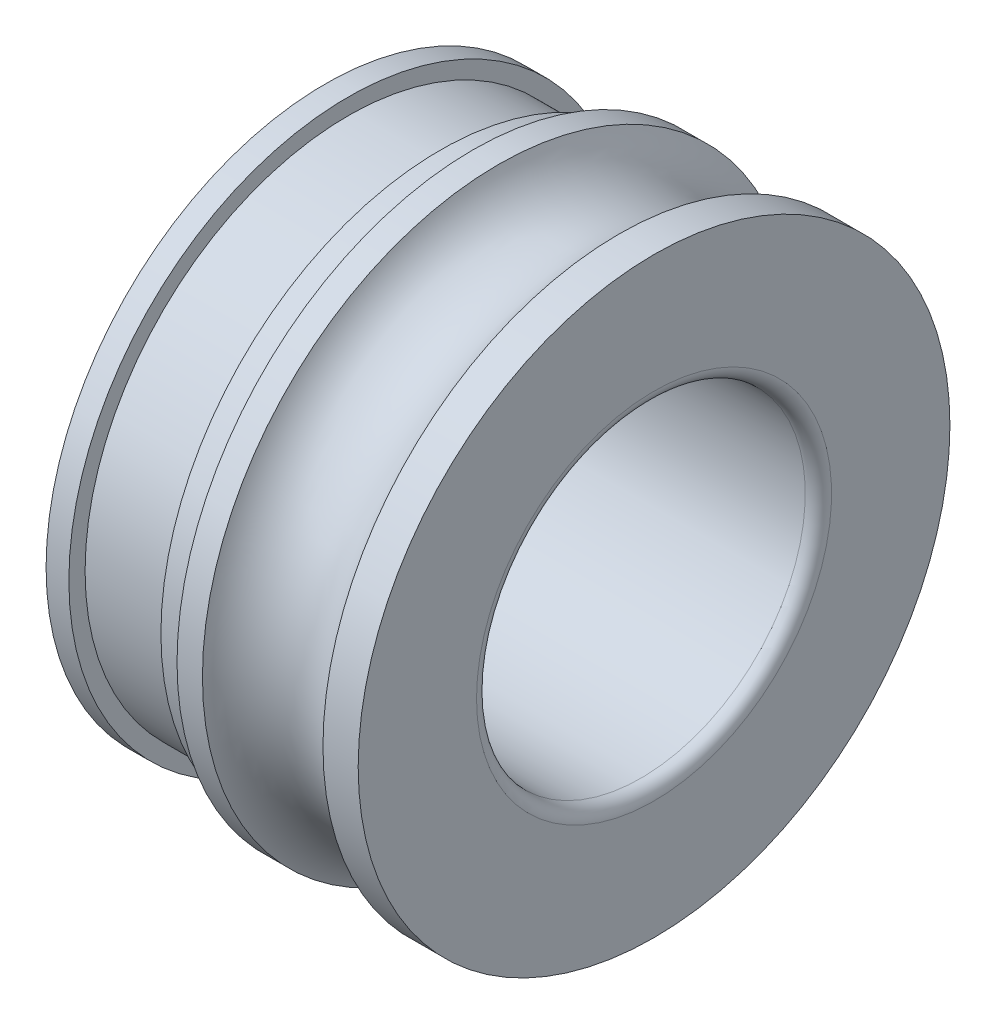
ISO-10303-21;
HEADER;
FILE_DESCRIPTION(('STEP AP214'),'2;1');
FILE_NAME('part.step','',(''),(''),'','','');
FILE_SCHEMA(('AUTOMOTIVE_DESIGN { 1 0 10303 214 1 1 1 1 }'));
ENDSEC;
DATA;
#1=APPLICATION_CONTEXT('core data for automotive mechanical design processes');
#2=APPLICATION_PROTOCOL_DEFINITION('international standard','automotive_design',2000,#1);
#3=PRODUCT_CONTEXT('',#1,'mechanical');
#4=PRODUCT('Part','Part','',(#3));
#5=PRODUCT_RELATED_PRODUCT_CATEGORY('part','',(#4));
#6=PRODUCT_DEFINITION_FORMATION('','',#4);
#7=PRODUCT_DEFINITION_CONTEXT('part definition',#1,'design');
#8=PRODUCT_DEFINITION('design','',#6,#7);
#9=PRODUCT_DEFINITION_SHAPE('','',#8);
#10=(LENGTH_UNIT() NAMED_UNIT(*) SI_UNIT(.MILLI.,.METRE.));
#11=(NAMED_UNIT(*) PLANE_ANGLE_UNIT() SI_UNIT($,.RADIAN.));
#12=(NAMED_UNIT(*) SI_UNIT($,.STERADIAN.) SOLID_ANGLE_UNIT());
#13=UNCERTAINTY_MEASURE_WITH_UNIT(LENGTH_MEASURE(1.E-05),#10,'distance_accuracy_value','');
#14=(GEOMETRIC_REPRESENTATION_CONTEXT(3) GLOBAL_UNCERTAINTY_ASSIGNED_CONTEXT((#13)) GLOBAL_UNIT_ASSIGNED_CONTEXT((#10,
#11,#12)) REPRESENTATION_CONTEXT('',''));
#15=CARTESIAN_POINT('',(0.,0.,0.));
#16=DIRECTION('',(0.,0.,1.));
#17=DIRECTION('',(1.,0.,0.));
#18=AXIS2_PLACEMENT_3D('',#15,#16,#17);
#19=CARTESIAN_POINT('',(11.2321867507415,0.,0.));
#20=DIRECTION('',(1.,0.,0.));
#21=DIRECTION('',(0.,0.,-1.));
#22=AXIS2_PLACEMENT_3D('',#19,#20,#21);
#23=CONICAL_SURFACE('',#22,21.25,0.00652812454173153);
#24=CARTESIAN_POINT('',(8.73218675074151,0.,0.));
#25=DIRECTION('',(-1.,0.,0.));
#26=DIRECTION('',(0.,0.,1.));
#27=AXIS2_PLACEMENT_3D('',#24,#25,#26);
#28=CIRCLE('',#27,21.233679456804);
#29=CARTESIAN_POINT('',(8.73218675074151,0.,21.233679456804));
#30=VERTEX_POINT('',#29);
#31=EDGE_CURVE('E77',#30,#30,#28,.T.);
#32=ORIENTED_EDGE('',*,*,#31,.F.);
#33=EDGE_LOOP('',(#32));
#34=FACE_BOUND('',#33,.T.);
#35=CARTESIAN_POINT('',(11.2321867507415,0.,0.));
#36=DIRECTION('',(-1.,0.,0.));
#37=DIRECTION('',(0.,0.,1.));
#38=AXIS2_PLACEMENT_3D('',#35,#36,#37);
#39=CIRCLE('',#38,21.25);
#40=CARTESIAN_POINT('',(11.2321867507415,0.,21.25));
#41=VERTEX_POINT('',#40);
#42=EDGE_CURVE('E10',#41,#41,#39,.T.);
#43=ORIENTED_EDGE('',*,*,#42,.T.);
#44=EDGE_LOOP('',(#43));
#45=FACE_BOUND('',#44,.T.);
#46=ADVANCED_FACE('F31',(#34,#45),#23,.T.);
#47=CARTESIAN_POINT('',(11.2240265104039,0.,0.));
#48=DIRECTION('',(-1.,0.,0.));
#49=DIRECTION('',(0.,0.,1.));
#50=AXIS2_PLACEMENT_3D('',#47,#48,#49);
#51=CONICAL_SURFACE('',#50,22.4999952114941,1.56426820225317);
#52=ORIENTED_EDGE('',*,*,#42,.F.);
#53=EDGE_LOOP('',(#52));
#54=FACE_BOUND('',#53,.T.);
#55=CARTESIAN_POINT('',(11.2240265104039,0.,0.));
#56=DIRECTION('',(-1.,0.,0.));
#57=DIRECTION('',(0.,0.,1.));
#58=AXIS2_PLACEMENT_3D('',#55,#56,#57);
#59=CIRCLE('',#58,22.4999952114941);
#60=CARTESIAN_POINT('',(11.2240265104039,0.,22.4999952114941));
#61=VERTEX_POINT('',#60);
#62=EDGE_CURVE('E37',#61,#61,#59,.T.);
#63=ORIENTED_EDGE('',*,*,#62,.T.);
#64=EDGE_LOOP('',(#63));
#65=FACE_BOUND('',#64,.T.);
#66=ADVANCED_FACE('F84',(#54,#65),#51,.F.);
#67=CARTESIAN_POINT('',(0.,0.,0.));
#68=DIRECTION('',(-1.,0.,0.));
#69=DIRECTION('',(0.,0.,1.));
#70=AXIS2_PLACEMENT_3D('',#67,#68,#69);
#71=CYLINDRICAL_SURFACE('',#70,22.4999952114941);
#72=ORIENTED_EDGE('',*,*,#62,.F.);
#73=EDGE_LOOP('',(#72));
#74=FACE_BOUND('',#73,.T.);
#75=CARTESIAN_POINT('',(13.1562316517497,0.,0.));
#76=DIRECTION('',(-1.,0.,0.));
#77=DIRECTION('',(0.,0.,1.));
#78=AXIS2_PLACEMENT_3D('',#75,#76,#77);
#79=CIRCLE('',#78,22.4999952114941);
#80=CARTESIAN_POINT('',(13.1562316517497,0.,22.4999952114941));
#81=VERTEX_POINT('',#80);
#82=EDGE_CURVE('E41',#81,#81,#79,.T.);
#83=ORIENTED_EDGE('',*,*,#82,.T.);
#84=EDGE_LOOP('',(#83));
#85=FACE_BOUND('',#84,.T.);
#86=ADVANCED_FACE('F88',(#74,#85),#71,.T.);
#87=CARTESIAN_POINT('',(17.7388073467056,0.,0.));
#88=DIRECTION('',(-1.,0.,0.));
#89=DIRECTION('',(0.,0.,1.));
#90=AXIS2_PLACEMENT_3D('',#87,#88,#89);
#91=TOROIDAL_SURFACE('',#90,24.4999952114941,5.);
#92=ORIENTED_EDGE('',*,*,#82,.F.);
#93=EDGE_LOOP('',(#92));
#94=FACE_BOUND('',#93,.T.);
#95=CARTESIAN_POINT('',(22.3213830416614,0.,0.));
#96=DIRECTION('',(-1.,0.,0.));
#97=DIRECTION('',(0.,0.,1.));
#98=AXIS2_PLACEMENT_3D('',#95,#96,#97);
#99=CIRCLE('',#98,22.4999952114941);
#100=CARTESIAN_POINT('',(22.3213830416614,0.,22.4999952114941));
#101=VERTEX_POINT('',#100);
#102=EDGE_CURVE('E45',#101,#101,#99,.T.);
#103=ORIENTED_EDGE('',*,*,#102,.T.);
#104=EDGE_LOOP('',(#103));
#105=FACE_BOUND('',#104,.T.);
#106=ADVANCED_FACE('F93',(#94,#105),#91,.F.);
#107=CARTESIAN_POINT('',(0.,0.,0.));
#108=DIRECTION('',(-1.,0.,0.));
#109=DIRECTION('',(0.,0.,1.));
#110=AXIS2_PLACEMENT_3D('',#107,#108,#109);
#111=CYLINDRICAL_SURFACE('',#110,22.499997605747);
#112=ORIENTED_EDGE('',*,*,#102,.F.);
#113=EDGE_LOOP('',(#112));
#114=FACE_BOUND('',#113,.T.);
#115=CARTESIAN_POINT('',(25.,0.,0.));
#116=DIRECTION('',(-1.,0.,0.));
#117=DIRECTION('',(0.,0.,1.));
#118=AXIS2_PLACEMENT_3D('',#115,#116,#117);
#119=CIRCLE('',#118,22.5);
#120=CARTESIAN_POINT('',(25.,0.,22.5));
#121=VERTEX_POINT('',#120);
#122=EDGE_CURVE('E50',#121,#121,#119,.T.);
#123=ORIENTED_EDGE('',*,*,#122,.T.);
#124=EDGE_LOOP('',(#123));
#125=FACE_BOUND('',#124,.T.);
#126=ADVANCED_FACE('F99',(#114,#125),#111,.T.);
#127=CARTESIAN_POINT('',(25.,13.5,0.));
#128=DIRECTION('',(-1.,0.,0.));
#129=DIRECTION('',(0.,0.,1.));
#130=AXIS2_PLACEMENT_3D('',#127,#128,#129);
#131=PLANE('',#130);
#132=ORIENTED_EDGE('',*,*,#122,.F.);
#133=EDGE_LOOP('',(#132));
#134=FACE_BOUND('',#133,.T.);
#135=CARTESIAN_POINT('',(25.,0.,0.));
#136=DIRECTION('',(-1.,0.,0.));
#137=DIRECTION('',(0.,0.,1.));
#138=AXIS2_PLACEMENT_3D('',#135,#136,#137);
#139=CIRCLE('',#138,13.5);
#140=CARTESIAN_POINT('',(25.,0.,13.5));
#141=VERTEX_POINT('',#140);
#142=EDGE_CURVE('E53',#141,#141,#139,.T.);
#143=ORIENTED_EDGE('',*,*,#142,.T.);
#144=EDGE_LOOP('',(#143));
#145=FACE_BOUND('',#144,.T.);
#146=ADVANCED_FACE('F103',(#134,#145),#131,.F.);
#147=CARTESIAN_POINT('',(24.,0.,0.));
#148=DIRECTION('',(-1.,0.,0.));
#149=DIRECTION('',(0.,0.,1.));
#150=AXIS2_PLACEMENT_3D('',#147,#148,#149);
#151=TOROIDAL_SURFACE('',#150,13.5,1.);
#152=ORIENTED_EDGE('',*,*,#142,.F.);
#153=EDGE_LOOP('',(#152));
#154=FACE_BOUND('',#153,.T.);
#155=CARTESIAN_POINT('',(24.,0.,0.));
#156=DIRECTION('',(-1.,0.,0.));
#157=DIRECTION('',(0.,0.,1.));
#158=AXIS2_PLACEMENT_3D('',#155,#156,#157);
#159=CIRCLE('',#158,12.5);
#160=CARTESIAN_POINT('',(24.,0.,12.5));
#161=VERTEX_POINT('',#160);
#162=EDGE_CURVE('E56',#161,#161,#159,.T.);
#163=ORIENTED_EDGE('',*,*,#162,.T.);
#164=EDGE_LOOP('',(#163));
#165=FACE_BOUND('',#164,.T.);
#166=ADVANCED_FACE('F107',(#154,#165),#151,.T.);
#167=CARTESIAN_POINT('',(0.,0.,0.));
#168=DIRECTION('',(-1.,0.,0.));
#169=DIRECTION('',(0.,0.,1.));
#170=AXIS2_PLACEMENT_3D('',#167,#168,#169);
#171=CYLINDRICAL_SURFACE('',#170,12.5);
#172=ORIENTED_EDGE('',*,*,#162,.F.);
#173=EDGE_LOOP('',(#172));
#174=FACE_BOUND('',#173,.T.);
#175=CARTESIAN_POINT('',(1.00000000000001,0.,0.));
#176=DIRECTION('',(-1.,0.,0.));
#177=DIRECTION('',(0.,0.,1.));
#178=AXIS2_PLACEMENT_3D('',#175,#176,#177);
#179=CIRCLE('',#178,12.5);
#180=CARTESIAN_POINT('',(1.00000000000001,0.,12.5));
#181=VERTEX_POINT('',#180);
#182=EDGE_CURVE('E59',#181,#181,#179,.T.);
#183=ORIENTED_EDGE('',*,*,#182,.T.);
#184=EDGE_LOOP('',(#183));
#185=FACE_BOUND('',#184,.T.);
#186=ADVANCED_FACE('F111',(#174,#185),#171,.F.);
#187=CARTESIAN_POINT('',(1.,0.,0.));
#188=DIRECTION('',(-1.,0.,0.));
#189=DIRECTION('',(0.,0.,1.));
#190=AXIS2_PLACEMENT_3D('',#187,#188,#189);
#191=TOROIDAL_SURFACE('',#190,13.5,1.);
#192=ORIENTED_EDGE('',*,*,#182,.F.);
#193=EDGE_LOOP('',(#192));
#194=FACE_BOUND('',#193,.T.);
#195=CARTESIAN_POINT('',(0.,0.,0.));
#196=DIRECTION('',(-1.,0.,0.));
#197=DIRECTION('',(0.,0.,1.));
#198=AXIS2_PLACEMENT_3D('',#195,#196,#197);
#199=CIRCLE('',#198,13.5);
#200=CARTESIAN_POINT('',(0.,0.,13.5));
#201=VERTEX_POINT('',#200);
#202=EDGE_CURVE('E62',#201,#201,#199,.T.);
#203=ORIENTED_EDGE('',*,*,#202,.T.);
#204=EDGE_LOOP('',(#203));
#205=FACE_BOUND('',#204,.T.);
#206=ADVANCED_FACE('F115',(#194,#205),#191,.T.);
#207=CARTESIAN_POINT('',(0.,21.233679456804,0.));
#208=DIRECTION('',(1.,0.,0.));
#209=DIRECTION('',(0.,0.,-1.));
#210=AXIS2_PLACEMENT_3D('',#207,#208,#209);
#211=PLANE('',#210);
#212=ORIENTED_EDGE('',*,*,#202,.F.);
#213=EDGE_LOOP('',(#212));
#214=FACE_BOUND('',#213,.T.);
#215=CARTESIAN_POINT('',(0.,0.,0.));
#216=DIRECTION('',(-1.,0.,0.));
#217=DIRECTION('',(0.,0.,1.));
#218=AXIS2_PLACEMENT_3D('',#215,#216,#217);
#219=CIRCLE('',#218,21.233679456804);
#220=CARTESIAN_POINT('',(0.,0.,21.233679456804));
#221=VERTEX_POINT('',#220);
#222=EDGE_CURVE('E65',#221,#221,#219,.T.);
#223=ORIENTED_EDGE('',*,*,#222,.T.);
#224=EDGE_LOOP('',(#223));
#225=FACE_BOUND('',#224,.T.);
#226=ADVANCED_FACE('F119',(#214,#225),#211,.F.);
#227=CARTESIAN_POINT('',(0.,0.,0.));
#228=DIRECTION('',(-1.,0.,0.));
#229=DIRECTION('',(0.,0.,1.));
#230=AXIS2_PLACEMENT_3D('',#227,#228,#229);
#231=CYLINDRICAL_SURFACE('',#230,21.233679456804);
#232=ORIENTED_EDGE('',*,*,#222,.F.);
#233=EDGE_LOOP('',(#232));
#234=FACE_BOUND('',#233,.T.);
#235=CARTESIAN_POINT('',(1.73218675074151,0.,0.));
#236=DIRECTION('',(-1.,0.,0.));
#237=DIRECTION('',(0.,0.,1.));
#238=AXIS2_PLACEMENT_3D('',#235,#236,#237);
#239=CIRCLE('',#238,21.233679456804);
#240=CARTESIAN_POINT('',(1.73218675074151,0.,21.233679456804));
#241=VERTEX_POINT('',#240);
#242=EDGE_CURVE('E68',#241,#241,#239,.T.);
#243=ORIENTED_EDGE('',*,*,#242,.T.);
#244=EDGE_LOOP('',(#243));
#245=FACE_BOUND('',#244,.T.);
#246=ADVANCED_FACE('F123',(#234,#245),#231,.T.);
#247=CARTESIAN_POINT('',(1.73218675074151,21.233679456804,0.));
#248=DIRECTION('',(-1.,0.,0.));
#249=DIRECTION('',(0.,0.,1.));
#250=AXIS2_PLACEMENT_3D('',#247,#248,#249);
#251=PLANE('',#250);
#252=ORIENTED_EDGE('',*,*,#242,.F.);
#253=EDGE_LOOP('',(#252));
#254=FACE_BOUND('',#253,.T.);
#255=CARTESIAN_POINT('',(1.73218675074156,0.,0.));
#256=DIRECTION('',(-1.,0.,0.));
#257=DIRECTION('',(0.,0.,1.));
#258=AXIS2_PLACEMENT_3D('',#255,#256,#257);
#259=CIRCLE('',#258,19.9999999999999);
#260=CARTESIAN_POINT('',(1.73218675074156,0.,19.9999999999999));
#261=VERTEX_POINT('',#260);
#262=EDGE_CURVE('E71',#261,#261,#259,.T.);
#263=ORIENTED_EDGE('',*,*,#262,.T.);
#264=EDGE_LOOP('',(#263));
#265=FACE_BOUND('',#264,.T.);
#266=ADVANCED_FACE('F127',(#254,#265),#251,.F.);
#267=CARTESIAN_POINT('',(0.,0.,0.));
#268=DIRECTION('',(-1.,0.,0.));
#269=DIRECTION('',(0.,0.,1.));
#270=AXIS2_PLACEMENT_3D('',#267,#268,#269);
#271=CYLINDRICAL_SURFACE('',#270,20.);
#272=ORIENTED_EDGE('',*,*,#262,.F.);
#273=EDGE_LOOP('',(#272));
#274=FACE_BOUND('',#273,.T.);
#275=CARTESIAN_POINT('',(8.73218675074151,0.,0.));
#276=DIRECTION('',(-1.,0.,0.));
#277=DIRECTION('',(0.,0.,1.));
#278=AXIS2_PLACEMENT_3D('',#275,#276,#277);
#279=CIRCLE('',#278,20.);
#280=CARTESIAN_POINT('',(8.73218675074151,0.,20.));
#281=VERTEX_POINT('',#280);
#282=EDGE_CURVE('E74',#281,#281,#279,.T.);
#283=ORIENTED_EDGE('',*,*,#282,.T.);
#284=EDGE_LOOP('',(#283));
#285=FACE_BOUND('',#284,.T.);
#286=ADVANCED_FACE('F131',(#274,#285),#271,.T.);
#287=CARTESIAN_POINT('',(8.73218675074151,21.233679456804,0.));
#288=DIRECTION('',(1.,0.,0.));
#289=DIRECTION('',(0.,0.,-1.));
#290=AXIS2_PLACEMENT_3D('',#287,#288,#289);
#291=PLANE('',#290);
#292=ORIENTED_EDGE('',*,*,#282,.F.);
#293=EDGE_LOOP('',(#292));
#294=FACE_BOUND('',#293,.T.);
#295=ORIENTED_EDGE('',*,*,#31,.T.);
#296=EDGE_LOOP('',(#295));
#297=FACE_BOUND('',#296,.T.);
#298=ADVANCED_FACE('F81',(#294,#297),#291,.F.);
#299=CLOSED_SHELL('',(#46,#66,#86,#106,#126,#146,#166,#186,#206,#226,#246,#266,#286,#298));
#300=MANIFOLD_SOLID_BREP('B2',#299);
#301=ADVANCED_BREP_SHAPE_REPRESENTATION('',(#18,#300),#14);
#302=SHAPE_DEFINITION_REPRESENTATION(#9,#301);
ENDSEC;
END-ISO-10303-21;
